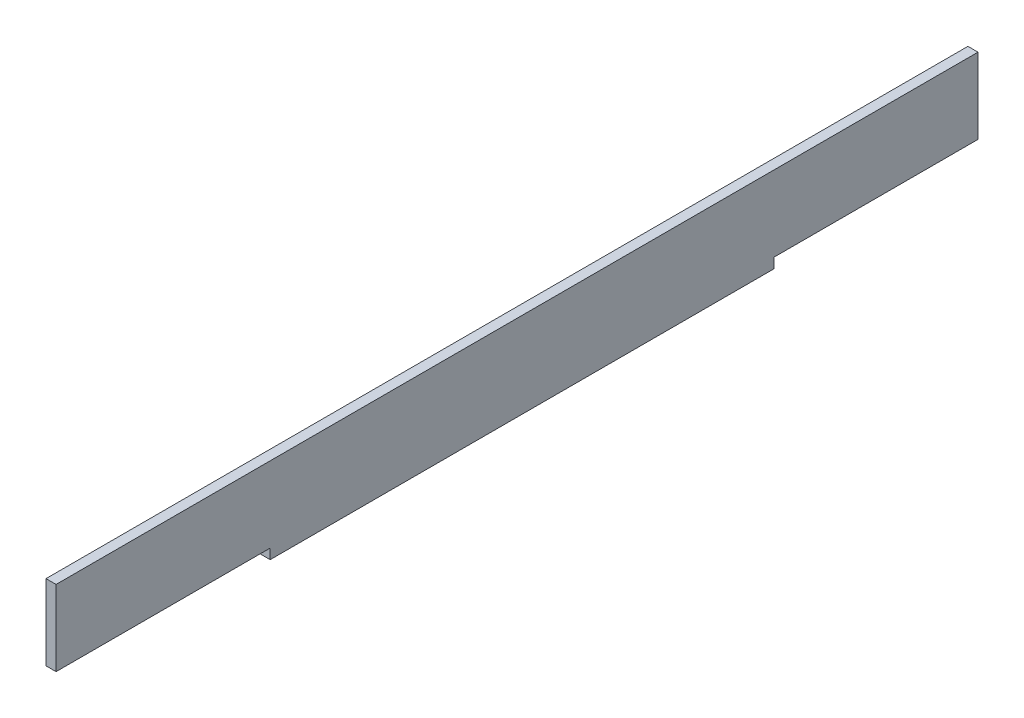
ISO-10303-21;
HEADER;
FILE_DESCRIPTION(('STEP AP214'),'2;1');
FILE_NAME('part.step','',(''),(''),'','','');
FILE_SCHEMA(('AUTOMOTIVE_DESIGN { 1 0 10303 214 1 1 1 1 }'));
ENDSEC;
DATA;
#1=APPLICATION_CONTEXT('core data for automotive mechanical design processes');
#2=APPLICATION_PROTOCOL_DEFINITION('international standard','automotive_design',2000,#1);
#3=PRODUCT_CONTEXT('',#1,'mechanical');
#4=PRODUCT('Part','Part','',(#3));
#5=PRODUCT_RELATED_PRODUCT_CATEGORY('part','',(#4));
#6=PRODUCT_DEFINITION_FORMATION('','',#4);
#7=PRODUCT_DEFINITION_CONTEXT('part definition',#1,'design');
#8=PRODUCT_DEFINITION('design','',#6,#7);
#9=PRODUCT_DEFINITION_SHAPE('','',#8);
#10=(LENGTH_UNIT() NAMED_UNIT(*) SI_UNIT(.MILLI.,.METRE.));
#11=(NAMED_UNIT(*) PLANE_ANGLE_UNIT() SI_UNIT($,.RADIAN.));
#12=(NAMED_UNIT(*) SI_UNIT($,.STERADIAN.) SOLID_ANGLE_UNIT());
#13=UNCERTAINTY_MEASURE_WITH_UNIT(LENGTH_MEASURE(1.E-05),#10,'distance_accuracy_value','');
#14=(GEOMETRIC_REPRESENTATION_CONTEXT(3) GLOBAL_UNCERTAINTY_ASSIGNED_CONTEXT((#13)) GLOBAL_UNIT_ASSIGNED_CONTEXT((#10,
#11,#12)) REPRESENTATION_CONTEXT('',''));
#15=CARTESIAN_POINT('',(0.,0.,0.));
#16=DIRECTION('',(0.,0.,1.));
#17=DIRECTION('',(1.,0.,0.));
#18=AXIS2_PLACEMENT_3D('',#15,#16,#17);
#19=CARTESIAN_POINT('',(4.,-7.46361902169318,117.967275659467));
#20=DIRECTION('',(0.,0.,-1.));
#21=DIRECTION('',(-1.,0.,0.));
#22=AXIS2_PLACEMENT_3D('',#19,#20,#21);
#23=PLANE('',#22);
#24=DIRECTION('',(0.,-1.,0.));
#25=VECTOR('',#24,1.);
#26=CARTESIAN_POINT('',(0.,-7.46361902169318,117.967275659467));
#27=LINE('',#26,#25);
#28=CARTESIAN_POINT('',(0.,-7.46361902169318,117.967275659467));
#29=VERTEX_POINT('',#28);
#30=CARTESIAN_POINT('',(0.,-11.4636190216932,117.967275659467));
#31=VERTEX_POINT('',#30);
#32=EDGE_CURVE('E149',#29,#31,#27,.T.);
#33=ORIENTED_EDGE('',*,*,#32,.T.);
#34=DIRECTION('',(-1.,0.,0.));
#35=VECTOR('',#34,1.);
#36=CARTESIAN_POINT('',(4.,-11.4636190216932,117.967275659467));
#37=LINE('',#36,#35);
#38=CARTESIAN_POINT('',(4.,-11.4636190216932,117.967275659467));
#39=VERTEX_POINT('',#38);
#40=EDGE_CURVE('E11',#39,#31,#37,.T.);
#41=ORIENTED_EDGE('',*,*,#40,.F.);
#42=DIRECTION('',(0.,-1.,0.));
#43=VECTOR('',#42,1.);
#44=CARTESIAN_POINT('',(4.,-7.46361902169318,117.967275659467));
#45=LINE('',#44,#43);
#46=CARTESIAN_POINT('',(4.,-7.46361902169318,117.967275659467));
#47=VERTEX_POINT('',#46);
#48=EDGE_CURVE('E172',#47,#39,#45,.T.);
#49=ORIENTED_EDGE('',*,*,#48,.F.);
#50=DIRECTION('',(-1.,0.,0.));
#51=VECTOR('',#50,1.);
#52=CARTESIAN_POINT('',(4.,-7.46361902169318,117.967275659467));
#53=LINE('',#52,#51);
#54=EDGE_CURVE('E145',#47,#29,#53,.T.);
#55=ORIENTED_EDGE('',*,*,#54,.T.);
#56=EDGE_LOOP('',(#33,#41,#49,#55));
#57=FACE_BOUND('',#56,.T.);
#58=ADVANCED_FACE('F49',(#57),#23,.F.);
#59=CARTESIAN_POINT('',(4.,-11.4636190216932,117.967275659467));
#60=DIRECTION('',(0.,1.,0.));
#61=DIRECTION('',(0.,0.,1.));
#62=AXIS2_PLACEMENT_3D('',#59,#60,#61);
#63=PLANE('',#62);
#64=DIRECTION('',(0.,0.,-1.));
#65=VECTOR('',#64,1.);
#66=CARTESIAN_POINT('',(0.,-11.4636190216932,117.967275659467));
#67=LINE('',#66,#65);
#68=CARTESIAN_POINT('',(0.,-11.4636190216932,-82.0327243405328));
#69=VERTEX_POINT('',#68);
#70=EDGE_CURVE('E153',#31,#69,#67,.T.);
#71=ORIENTED_EDGE('',*,*,#70,.T.);
#72=DIRECTION('',(-1.,0.,0.));
#73=VECTOR('',#72,1.);
#74=CARTESIAN_POINT('',(4.,-11.4636190216932,-82.0327243405328));
#75=LINE('',#74,#73);
#76=CARTESIAN_POINT('',(4.,-11.4636190216932,-82.0327243405328));
#77=VERTEX_POINT('',#76);
#78=EDGE_CURVE('E58',#77,#69,#75,.T.);
#79=ORIENTED_EDGE('',*,*,#78,.F.);
#80=DIRECTION('',(0.,0.,-1.));
#81=VECTOR('',#80,1.);
#82=CARTESIAN_POINT('',(4.,-11.4636190216932,117.967275659467));
#83=LINE('',#82,#81);
#84=EDGE_CURVE('E109',#39,#77,#83,.T.);
#85=ORIENTED_EDGE('',*,*,#84,.F.);
#86=ORIENTED_EDGE('',*,*,#40,.T.);
#87=EDGE_LOOP('',(#71,#79,#85,#86));
#88=FACE_BOUND('',#87,.T.);
#89=ADVANCED_FACE('F218',(#88),#63,.F.);
#90=CARTESIAN_POINT('',(4.,-11.4636190216932,-82.0327243405328));
#91=DIRECTION('',(0.,0.,1.));
#92=DIRECTION('',(1.,0.,0.));
#93=AXIS2_PLACEMENT_3D('',#90,#91,#92);
#94=PLANE('',#93);
#95=DIRECTION('',(0.,1.,0.));
#96=VECTOR('',#95,1.);
#97=CARTESIAN_POINT('',(0.,-11.4636190216932,-82.0327243405328));
#98=LINE('',#97,#96);
#99=CARTESIAN_POINT('',(0.,-7.46361902169318,-82.0327243405328));
#100=VERTEX_POINT('',#99);
#101=EDGE_CURVE('E156',#69,#100,#98,.T.);
#102=ORIENTED_EDGE('',*,*,#101,.T.);
#103=DIRECTION('',(-1.,0.,0.));
#104=VECTOR('',#103,1.);
#105=CARTESIAN_POINT('',(4.,-7.46361902169318,-82.0327243405328));
#106=LINE('',#105,#104);
#107=CARTESIAN_POINT('',(4.,-7.46361902169318,-82.0327243405328));
#108=VERTEX_POINT('',#107);
#109=EDGE_CURVE('E183',#108,#100,#106,.T.);
#110=ORIENTED_EDGE('',*,*,#109,.F.);
#111=DIRECTION('',(0.,1.,0.));
#112=VECTOR('',#111,1.);
#113=CARTESIAN_POINT('',(4.,-11.4636190216932,-82.0327243405328));
#114=LINE('',#113,#112);
#115=EDGE_CURVE('E193',#77,#108,#114,.T.);
#116=ORIENTED_EDGE('',*,*,#115,.F.);
#117=ORIENTED_EDGE('',*,*,#78,.T.);
#118=EDGE_LOOP('',(#102,#110,#116,#117));
#119=FACE_BOUND('',#118,.T.);
#120=ADVANCED_FACE('F191',(#119),#94,.F.);
#121=CARTESIAN_POINT('',(4.,-7.46361902169318,-82.0327243405328));
#122=DIRECTION('',(0.,1.,0.));
#123=DIRECTION('',(0.,0.,1.));
#124=AXIS2_PLACEMENT_3D('',#121,#122,#123);
#125=PLANE('',#124);
#126=DIRECTION('',(0.,0.,-1.));
#127=VECTOR('',#126,1.);
#128=CARTESIAN_POINT('',(0.,-7.46361902169318,-82.0327243405328));
#129=LINE('',#128,#127);
#130=CARTESIAN_POINT('',(0.,-7.46361902169318,-163.032724340533));
#131=VERTEX_POINT('',#130);
#132=EDGE_CURVE('E159',#100,#131,#129,.T.);
#133=ORIENTED_EDGE('',*,*,#132,.T.);
#134=DIRECTION('',(-1.,0.,0.));
#135=VECTOR('',#134,1.);
#136=CARTESIAN_POINT('',(4.,-7.46361902169318,-163.032724340533));
#137=LINE('',#136,#135);
#138=CARTESIAN_POINT('',(4.,-7.46361902169318,-163.032724340533));
#139=VERTEX_POINT('',#138);
#140=EDGE_CURVE('E179',#139,#131,#137,.T.);
#141=ORIENTED_EDGE('',*,*,#140,.F.);
#142=DIRECTION('',(0.,0.,-1.));
#143=VECTOR('',#142,1.);
#144=CARTESIAN_POINT('',(4.,-7.46361902169318,-82.0327243405328));
#145=LINE('',#144,#143);
#146=EDGE_CURVE('E206',#108,#139,#145,.T.);
#147=ORIENTED_EDGE('',*,*,#146,.F.);
#148=ORIENTED_EDGE('',*,*,#109,.T.);
#149=EDGE_LOOP('',(#133,#141,#147,#148));
#150=FACE_BOUND('',#149,.T.);
#151=ADVANCED_FACE('F201',(#150),#125,.F.);
#152=CARTESIAN_POINT('',(4.,-7.46361902169318,-163.032724340533));
#153=DIRECTION('',(0.,0.,1.));
#154=DIRECTION('',(1.,0.,0.));
#155=AXIS2_PLACEMENT_3D('',#152,#153,#154);
#156=PLANE('',#155);
#157=DIRECTION('',(0.,1.,0.));
#158=VECTOR('',#157,1.);
#159=CARTESIAN_POINT('',(0.,-7.46361902169318,-163.032724340533));
#160=LINE('',#159,#158);
#161=CARTESIAN_POINT('',(0.,22.5363809783068,-163.032724340533));
#162=VERTEX_POINT('',#161);
#163=EDGE_CURVE('E162',#131,#162,#160,.T.);
#164=ORIENTED_EDGE('',*,*,#163,.T.);
#165=DIRECTION('',(-1.,0.,0.));
#166=VECTOR('',#165,1.);
#167=CARTESIAN_POINT('',(4.,22.5363809783068,-163.032724340533));
#168=LINE('',#167,#166);
#169=CARTESIAN_POINT('',(4.,22.5363809783068,-163.032724340533));
#170=VERTEX_POINT('',#169);
#171=EDGE_CURVE('E138',#170,#162,#168,.T.);
#172=ORIENTED_EDGE('',*,*,#171,.F.);
#173=DIRECTION('',(0.,1.,0.));
#174=VECTOR('',#173,1.);
#175=CARTESIAN_POINT('',(4.,-7.46361902169318,-163.032724340533));
#176=LINE('',#175,#174);
#177=EDGE_CURVE('E128',#139,#170,#176,.T.);
#178=ORIENTED_EDGE('',*,*,#177,.F.);
#179=ORIENTED_EDGE('',*,*,#140,.T.);
#180=EDGE_LOOP('',(#164,#172,#178,#179));
#181=FACE_BOUND('',#180,.T.);
#182=ADVANCED_FACE('F204',(#181),#156,.F.);
#183=CARTESIAN_POINT('',(4.,22.5363809783068,117.967275659467));
#184=DIRECTION('',(0.,-1.,0.));
#185=DIRECTION('',(0.,0.,-1.));
#186=AXIS2_PLACEMENT_3D('',#183,#184,#185);
#187=PLANE('',#186);
#188=DIRECTION('',(0.,0.,1.));
#189=VECTOR('',#188,1.);
#190=CARTESIAN_POINT('',(0.,22.5363809783068,117.967275659467));
#191=LINE('',#190,#189);
#192=CARTESIAN_POINT('',(0.,22.5363809783068,202.967275659467));
#193=VERTEX_POINT('',#192);
#194=EDGE_CURVE('E136',#162,#193,#191,.T.);
#195=ORIENTED_EDGE('',*,*,#194,.T.);
#196=DIRECTION('',(-1.,0.,0.));
#197=VECTOR('',#196,1.);
#198=CARTESIAN_POINT('',(4.,22.5363809783068,202.967275659467));
#199=LINE('',#198,#197);
#200=CARTESIAN_POINT('',(4.,22.5363809783068,202.967275659467));
#201=VERTEX_POINT('',#200);
#202=EDGE_CURVE('E134',#201,#193,#199,.T.);
#203=ORIENTED_EDGE('',*,*,#202,.F.);
#204=DIRECTION('',(0.,0.,1.));
#205=VECTOR('',#204,1.);
#206=CARTESIAN_POINT('',(4.,22.5363809783068,-163.032724340533));
#207=LINE('',#206,#205);
#208=EDGE_CURVE('E122',#170,#201,#207,.T.);
#209=ORIENTED_EDGE('',*,*,#208,.F.);
#210=ORIENTED_EDGE('',*,*,#171,.T.);
#211=EDGE_LOOP('',(#195,#203,#209,#210));
#212=FACE_BOUND('',#211,.T.);
#213=ADVANCED_FACE('F135',(#212),#187,.F.);
#214=CARTESIAN_POINT('',(4.,22.5363809783068,202.967275659467));
#215=DIRECTION('',(0.,0.,-1.));
#216=DIRECTION('',(-1.,0.,0.));
#217=AXIS2_PLACEMENT_3D('',#214,#215,#216);
#218=PLANE('',#217);
#219=DIRECTION('',(0.,-1.,0.));
#220=VECTOR('',#219,1.);
#221=CARTESIAN_POINT('',(0.,22.5363809783068,202.967275659467));
#222=LINE('',#221,#220);
#223=CARTESIAN_POINT('',(0.,-7.46361902169318,202.967275659467));
#224=VERTEX_POINT('',#223);
#225=EDGE_CURVE('E95',#193,#224,#222,.T.);
#226=ORIENTED_EDGE('',*,*,#225,.T.);
#227=DIRECTION('',(-1.,0.,0.));
#228=VECTOR('',#227,1.);
#229=CARTESIAN_POINT('',(4.,-7.46361902169318,202.967275659467));
#230=LINE('',#229,#228);
#231=CARTESIAN_POINT('',(4.,-7.46361902169318,202.967275659467));
#232=VERTEX_POINT('',#231);
#233=EDGE_CURVE('E139',#232,#224,#230,.T.);
#234=ORIENTED_EDGE('',*,*,#233,.F.);
#235=DIRECTION('',(0.,-1.,0.));
#236=VECTOR('',#235,1.);
#237=CARTESIAN_POINT('',(4.,22.5363809783068,202.967275659467));
#238=LINE('',#237,#236);
#239=EDGE_CURVE('E126',#201,#232,#238,.T.);
#240=ORIENTED_EDGE('',*,*,#239,.F.);
#241=ORIENTED_EDGE('',*,*,#202,.T.);
#242=EDGE_LOOP('',(#226,#234,#240,#241));
#243=FACE_BOUND('',#242,.T.);
#244=ADVANCED_FACE('F141',(#243),#218,.F.);
#245=CARTESIAN_POINT('',(4.,-7.46361902169318,202.967275659467));
#246=DIRECTION('',(0.,1.,0.));
#247=DIRECTION('',(0.,0.,1.));
#248=AXIS2_PLACEMENT_3D('',#245,#246,#247);
#249=PLANE('',#248);
#250=DIRECTION('',(0.,0.,-1.));
#251=VECTOR('',#250,1.);
#252=CARTESIAN_POINT('',(0.,-7.46361902169318,202.967275659467));
#253=LINE('',#252,#251);
#254=EDGE_CURVE('E101',#224,#29,#253,.T.);
#255=ORIENTED_EDGE('',*,*,#254,.T.);
#256=ORIENTED_EDGE('',*,*,#54,.F.);
#257=DIRECTION('',(0.,0.,-1.));
#258=VECTOR('',#257,1.);
#259=CARTESIAN_POINT('',(4.,-7.46361902169318,202.967275659467));
#260=LINE('',#259,#258);
#261=EDGE_CURVE('E66',#232,#47,#260,.T.);
#262=ORIENTED_EDGE('',*,*,#261,.F.);
#263=ORIENTED_EDGE('',*,*,#233,.T.);
#264=EDGE_LOOP('',(#255,#256,#262,#263));
#265=FACE_BOUND('',#264,.T.);
#266=ADVANCED_FACE('F234',(#265),#249,.F.);
#267=CARTESIAN_POINT('',(4.,0.,0.));
#268=DIRECTION('',(1.,0.,0.));
#269=DIRECTION('',(0.,0.,-1.));
#270=AXIS2_PLACEMENT_3D('',#267,#268,#269);
#271=PLANE('',#270);
#272=ORIENTED_EDGE('',*,*,#48,.T.);
#273=ORIENTED_EDGE('',*,*,#84,.T.);
#274=ORIENTED_EDGE('',*,*,#115,.T.);
#275=ORIENTED_EDGE('',*,*,#146,.T.);
#276=ORIENTED_EDGE('',*,*,#177,.T.);
#277=ORIENTED_EDGE('',*,*,#208,.T.);
#278=ORIENTED_EDGE('',*,*,#239,.T.);
#279=ORIENTED_EDGE('',*,*,#261,.T.);
#280=EDGE_LOOP('',(#272,#273,#274,#275,#276,#277,#278,#279));
#281=FACE_BOUND('',#280,.T.);
#282=ADVANCED_FACE('F124',(#281),#271,.T.);
#283=CARTESIAN_POINT('',(0.,0.,0.));
#284=DIRECTION('',(1.,0.,0.));
#285=DIRECTION('',(0.,0.,-1.));
#286=AXIS2_PLACEMENT_3D('',#283,#284,#285);
#287=PLANE('',#286);
#288=ORIENTED_EDGE('',*,*,#32,.F.);
#289=ORIENTED_EDGE('',*,*,#254,.F.);
#290=ORIENTED_EDGE('',*,*,#225,.F.);
#291=ORIENTED_EDGE('',*,*,#194,.F.);
#292=ORIENTED_EDGE('',*,*,#163,.F.);
#293=ORIENTED_EDGE('',*,*,#132,.F.);
#294=ORIENTED_EDGE('',*,*,#101,.F.);
#295=ORIENTED_EDGE('',*,*,#70,.F.);
#296=EDGE_LOOP('',(#288,#289,#290,#291,#292,#293,#294,#295));
#297=FACE_BOUND('',#296,.T.);
#298=ADVANCED_FACE('F197',(#297),#287,.F.);
#299=CLOSED_SHELL('',(#58,#89,#120,#151,#182,#213,#244,#266,#282,#298));
#300=MANIFOLD_SOLID_BREP('B2',#299);
#301=ADVANCED_BREP_SHAPE_REPRESENTATION('',(#18,#300),#14);
#302=SHAPE_DEFINITION_REPRESENTATION(#9,#301);
ENDSEC;
END-ISO-10303-21;
